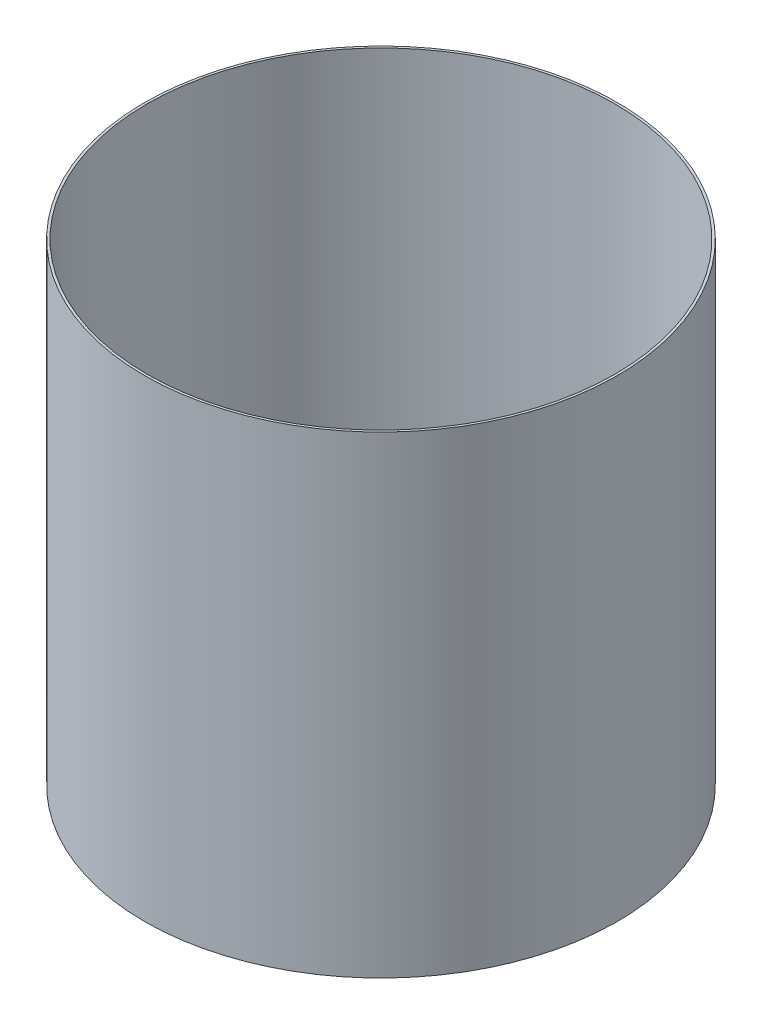
ISO-10303-21;
HEADER;
FILE_DESCRIPTION(('STEP AP214'),'2;1');
FILE_NAME('part.step','',(''),(''),'','','');
FILE_SCHEMA(('AUTOMOTIVE_DESIGN { 1 0 10303 214 1 1 1 1 }'));
ENDSEC;
DATA;
#1=APPLICATION_CONTEXT('core data for automotive mechanical design processes');
#2=APPLICATION_PROTOCOL_DEFINITION('international standard','automotive_design',2000,#1);
#3=PRODUCT_CONTEXT('',#1,'mechanical');
#4=PRODUCT('Part','Part','',(#3));
#5=PRODUCT_RELATED_PRODUCT_CATEGORY('part','',(#4));
#6=PRODUCT_DEFINITION_FORMATION('','',#4);
#7=PRODUCT_DEFINITION_CONTEXT('part definition',#1,'design');
#8=PRODUCT_DEFINITION('design','',#6,#7);
#9=PRODUCT_DEFINITION_SHAPE('','',#8);
#10=(LENGTH_UNIT() NAMED_UNIT(*) SI_UNIT(.MILLI.,.METRE.));
#11=(NAMED_UNIT(*) PLANE_ANGLE_UNIT() SI_UNIT($,.RADIAN.));
#12=(NAMED_UNIT(*) SI_UNIT($,.STERADIAN.) SOLID_ANGLE_UNIT());
#13=UNCERTAINTY_MEASURE_WITH_UNIT(LENGTH_MEASURE(1.E-05),#10,'distance_accuracy_value','');
#14=(GEOMETRIC_REPRESENTATION_CONTEXT(3) GLOBAL_UNCERTAINTY_ASSIGNED_CONTEXT((#13)) GLOBAL_UNIT_ASSIGNED_CONTEXT((#10,
#11,#12)) REPRESENTATION_CONTEXT('',''));
#15=CARTESIAN_POINT('',(0.,0.,0.));
#16=DIRECTION('',(0.,0.,1.));
#17=DIRECTION('',(1.,0.,0.));
#18=AXIS2_PLACEMENT_3D('',#15,#16,#17);
#19=CARTESIAN_POINT('',(0.,200.,0.));
#20=DIRECTION('',(0.,1.,0.));
#21=DIRECTION('',(0.,0.,1.));
#22=AXIS2_PLACEMENT_3D('',#19,#20,#21);
#23=PLANE('',#22);
#24=CARTESIAN_POINT('',(0.,200.,0.));
#25=DIRECTION('',(0.,1.,0.));
#26=DIRECTION('',(0.,0.,1.));
#27=AXIS2_PLACEMENT_3D('',#24,#25,#26);
#28=CIRCLE('',#27,100.);
#29=CARTESIAN_POINT('',(0.,200.,100.));
#30=VERTEX_POINT('',#29);
#31=EDGE_CURVE('E10',#30,#30,#28,.T.);
#32=ORIENTED_EDGE('',*,*,#31,.T.);
#33=EDGE_LOOP('',(#32));
#34=FACE_BOUND('',#33,.T.);
#35=CARTESIAN_POINT('',(0.,200.,0.));
#36=DIRECTION('',(0.,1.,0.));
#37=DIRECTION('',(0.,0.,1.));
#38=AXIS2_PLACEMENT_3D('',#35,#36,#37);
#39=CIRCLE('',#38,99.);
#40=CARTESIAN_POINT('',(0.,200.,99.));
#41=VERTEX_POINT('',#40);
#42=EDGE_CURVE('E44',#41,#41,#39,.T.);
#43=ORIENTED_EDGE('',*,*,#42,.F.);
#44=EDGE_LOOP('',(#43));
#45=FACE_BOUND('',#44,.T.);
#46=ADVANCED_FACE('F33',(#34,#45),#23,.T.);
#47=CARTESIAN_POINT('',(0.,0.,0.));
#48=DIRECTION('',(0.,1.,0.));
#49=DIRECTION('',(0.,0.,1.));
#50=AXIS2_PLACEMENT_3D('',#47,#48,#49);
#51=PLANE('',#50);
#52=CARTESIAN_POINT('',(0.,0.,0.));
#53=DIRECTION('',(0.,1.,0.));
#54=DIRECTION('',(0.,0.,1.));
#55=AXIS2_PLACEMENT_3D('',#52,#53,#54);
#56=CIRCLE('',#55,100.);
#57=CARTESIAN_POINT('',(0.,0.,100.));
#58=VERTEX_POINT('',#57);
#59=EDGE_CURVE('E37',#58,#58,#56,.T.);
#60=ORIENTED_EDGE('',*,*,#59,.F.);
#61=EDGE_LOOP('',(#60));
#62=FACE_BOUND('',#61,.T.);
#63=CARTESIAN_POINT('',(0.,0.,0.));
#64=DIRECTION('',(0.,1.,0.));
#65=DIRECTION('',(0.,0.,1.));
#66=AXIS2_PLACEMENT_3D('',#63,#64,#65);
#67=CIRCLE('',#66,99.);
#68=CARTESIAN_POINT('',(0.,0.,99.));
#69=VERTEX_POINT('',#68);
#70=EDGE_CURVE('E46',#69,#69,#67,.T.);
#71=ORIENTED_EDGE('',*,*,#70,.T.);
#72=EDGE_LOOP('',(#71));
#73=FACE_BOUND('',#72,.T.);
#74=ADVANCED_FACE('F56',(#62,#73),#51,.F.);
#75=CARTESIAN_POINT('',(0.,200.,0.));
#76=DIRECTION('',(0.,-1.,0.));
#77=DIRECTION('',(0.,0.,-1.));
#78=AXIS2_PLACEMENT_3D('',#75,#76,#77);
#79=CYLINDRICAL_SURFACE('',#78,100.);
#80=ORIENTED_EDGE('',*,*,#31,.F.);
#81=EDGE_LOOP('',(#80));
#82=FACE_BOUND('',#81,.T.);
#83=ORIENTED_EDGE('',*,*,#59,.T.);
#84=EDGE_LOOP('',(#83));
#85=FACE_BOUND('',#84,.T.);
#86=ADVANCED_FACE('F35',(#82,#85),#79,.T.);
#87=CARTESIAN_POINT('',(0.,200.,0.));
#88=DIRECTION('',(0.,-1.,0.));
#89=DIRECTION('',(0.,0.,-1.));
#90=AXIS2_PLACEMENT_3D('',#87,#88,#89);
#91=CYLINDRICAL_SURFACE('',#90,99.);
#92=ORIENTED_EDGE('',*,*,#42,.T.);
#93=EDGE_LOOP('',(#92));
#94=FACE_BOUND('',#93,.T.);
#95=ORIENTED_EDGE('',*,*,#70,.F.);
#96=EDGE_LOOP('',(#95));
#97=FACE_BOUND('',#96,.T.);
#98=ADVANCED_FACE('F52',(#94,#97),#91,.F.);
#99=CLOSED_SHELL('',(#46,#74,#86,#98));
#100=MANIFOLD_SOLID_BREP('B2',#99);
#101=ADVANCED_BREP_SHAPE_REPRESENTATION('',(#18,#100),#14);
#102=SHAPE_DEFINITION_REPRESENTATION(#9,#101);
ENDSEC;
END-ISO-10303-21;
